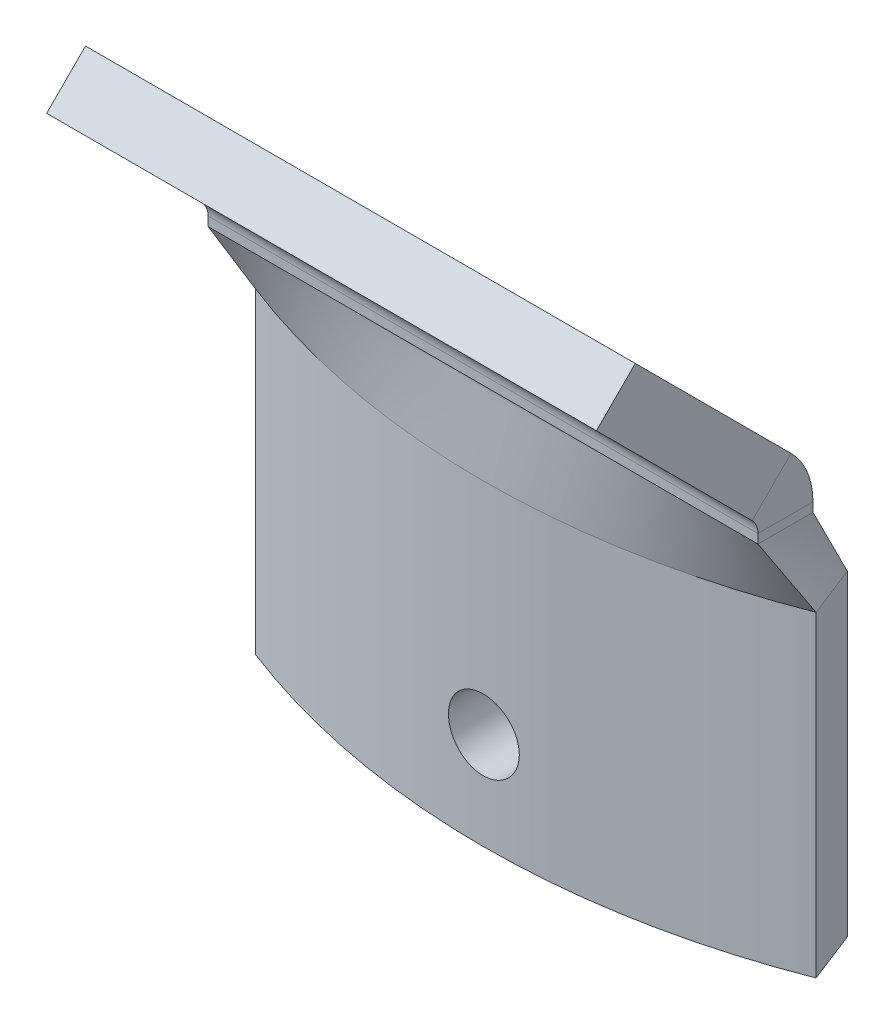
ISO-10303-21;
HEADER;
FILE_DESCRIPTION(('STEP AP214'),'2;1');
FILE_NAME('part.step','',(''),(''),'','','');
FILE_SCHEMA(('AUTOMOTIVE_DESIGN { 1 0 10303 214 1 1 1 1 }'));
ENDSEC;
DATA;
#1=APPLICATION_CONTEXT('core data for automotive mechanical design processes');
#2=APPLICATION_PROTOCOL_DEFINITION('international standard','automotive_design',2000,#1);
#3=PRODUCT_CONTEXT('',#1,'mechanical');
#4=PRODUCT('Part','Part','',(#3));
#5=PRODUCT_RELATED_PRODUCT_CATEGORY('part','',(#4));
#6=PRODUCT_DEFINITION_FORMATION('','',#4);
#7=PRODUCT_DEFINITION_CONTEXT('part definition',#1,'design');
#8=PRODUCT_DEFINITION('design','',#6,#7);
#9=PRODUCT_DEFINITION_SHAPE('','',#8);
#10=(LENGTH_UNIT() NAMED_UNIT(*) SI_UNIT(.MILLI.,.METRE.));
#11=(NAMED_UNIT(*) PLANE_ANGLE_UNIT() SI_UNIT($,.RADIAN.));
#12=(NAMED_UNIT(*) SI_UNIT($,.STERADIAN.) SOLID_ANGLE_UNIT());
#13=UNCERTAINTY_MEASURE_WITH_UNIT(LENGTH_MEASURE(1.E-05),#10,'distance_accuracy_value','');
#14=(GEOMETRIC_REPRESENTATION_CONTEXT(3) GLOBAL_UNCERTAINTY_ASSIGNED_CONTEXT((#13)) GLOBAL_UNIT_ASSIGNED_CONTEXT((#10,
#11,#12)) REPRESENTATION_CONTEXT('',''));
#15=CARTESIAN_POINT('',(0.,0.,0.));
#16=DIRECTION('',(0.,0.,1.));
#17=DIRECTION('',(1.,0.,0.));
#18=AXIS2_PLACEMENT_3D('',#15,#16,#17);
#19=CARTESIAN_POINT('',(15.875,27.8049191854904,12.5038015345885));
#20=DIRECTION('',(-1.,0.,0.));
#21=DIRECTION('',(0.,-0.707106781186546,-0.707106781186549));
#22=AXIS2_PLACEMENT_3D('',#19,#20,#21);
#23=PLANE('',#22);
#24=DIRECTION('',(0.,0.707106781186546,0.707106781186549));
#25=VECTOR('',#24,1.);
#26=CARTESIAN_POINT('',(15.875,27.8049191854904,12.5038015345885));
#27=LINE('',#26,#25);
#28=CARTESIAN_POINT('',(15.875,18.8108946000057,3.50977694910378));
#29=VERTEX_POINT('',#28);
#30=CARTESIAN_POINT('',(15.875,27.8049191854904,12.5038015345885));
#31=VERTEX_POINT('',#30);
#32=EDGE_CURVE('E126',#29,#31,#27,.T.);
#33=ORIENTED_EDGE('',*,*,#32,.F.);
#34=DIRECTION('',(0.,0.707106781186554,-0.707106781186541));
#35=VECTOR('',#34,1.);
#36=CARTESIAN_POINT('',(15.875,18.8108946000058,3.5097769491037));
#37=LINE('',#36,#35);
#38=CARTESIAN_POINT('',(15.875,21.055958630273,1.26471291883649));
#39=VERTEX_POINT('',#38);
#40=EDGE_CURVE('E379',#29,#39,#37,.T.);
#41=ORIENTED_EDGE('',*,*,#40,.T.);
#42=DIRECTION('',(0.,0.707106781186546,0.707106781186549));
#43=VECTOR('',#42,1.);
#44=CARTESIAN_POINT('',(15.875,30.0499832157577,10.2587375043212));
#45=LINE('',#44,#43);
#46=CARTESIAN_POINT('',(15.875,30.0499832157577,10.2587375043212));
#47=VERTEX_POINT('',#46);
#48=EDGE_CURVE('E82',#39,#47,#45,.T.);
#49=ORIENTED_EDGE('',*,*,#48,.T.);
#50=DIRECTION('',(0.,0.707106781186549,-0.707106781186546));
#51=VECTOR('',#50,1.);
#52=CARTESIAN_POINT('',(15.875,27.8049191854904,12.5038015345885));
#53=LINE('',#52,#51);
#54=EDGE_CURVE('E461',#31,#47,#53,.T.);
#55=ORIENTED_EDGE('',*,*,#54,.F.);
#56=EDGE_LOOP('',(#33,#41,#49,#55));
#57=FACE_BOUND('',#56,.T.);
#58=ADVANCED_FACE('F61',(#57),#23,.F.);
#59=CARTESIAN_POINT('',(-15.875,27.8049191854904,12.5038015345885));
#60=DIRECTION('',(1.,0.,0.));
#61=DIRECTION('',(0.,0.707106781186546,0.707106781186549));
#62=AXIS2_PLACEMENT_3D('',#59,#60,#61);
#63=PLANE('',#62);
#64=DIRECTION('',(0.,-0.707106781186546,-0.707106781186549));
#65=VECTOR('',#64,1.);
#66=CARTESIAN_POINT('',(-15.875,30.0499832157577,10.2587375043212));
#67=LINE('',#66,#65);
#68=CARTESIAN_POINT('',(-15.875,30.0499832157577,10.2587375043212));
#69=VERTEX_POINT('',#68);
#70=CARTESIAN_POINT('',(-15.875,21.055958630273,1.26471291883649));
#71=VERTEX_POINT('',#70);
#72=EDGE_CURVE('E415',#69,#71,#67,.T.);
#73=ORIENTED_EDGE('',*,*,#72,.T.);
#74=DIRECTION('',(0.,-0.707106781186554,0.707106781186541));
#75=VECTOR('',#74,1.);
#76=CARTESIAN_POINT('',(-15.875,18.8108946000058,3.5097769491037));
#77=LINE('',#76,#75);
#78=CARTESIAN_POINT('',(-15.875,18.8108946000057,3.50977694910378));
#79=VERTEX_POINT('',#78);
#80=EDGE_CURVE('E464',#71,#79,#77,.T.);
#81=ORIENTED_EDGE('',*,*,#80,.T.);
#82=DIRECTION('',(0.,-0.707106781186546,-0.707106781186549));
#83=VECTOR('',#82,1.);
#84=CARTESIAN_POINT('',(-15.875,27.8049191854904,12.5038015345885));
#85=LINE('',#84,#83);
#86=CARTESIAN_POINT('',(-15.875,27.8049191854904,12.5038015345885));
#87=VERTEX_POINT('',#86);
#88=EDGE_CURVE('E458',#87,#79,#85,.T.);
#89=ORIENTED_EDGE('',*,*,#88,.F.);
#90=DIRECTION('',(0.,0.707106781186549,-0.707106781186546));
#91=VECTOR('',#90,1.);
#92=CARTESIAN_POINT('',(-15.875,27.8049191854904,12.5038015345885));
#93=LINE('',#92,#91);
#94=EDGE_CURVE('E455',#87,#69,#93,.T.);
#95=ORIENTED_EDGE('',*,*,#94,.T.);
#96=EDGE_LOOP('',(#73,#81,#89,#95));
#97=FACE_BOUND('',#96,.T.);
#98=ADVANCED_FACE('F349',(#97),#63,.F.);
#99=CARTESIAN_POINT('',(0.,6.84500139891504,-12.9462443125215));
#100=DIRECTION('',(0.,-0.707106781186549,0.707106781186546));
#101=DIRECTION('',(1.,0.,0.));
#102=AXIS2_PLACEMENT_3D('',#99,#100,#101);
#103=PLANE('',#102);
#104=CARTESIAN_POINT('',(9.525,27.2481433059841,7.45689759454761));
#105=DIRECTION('',(0.,-0.707106781186549,0.707106781186546));
#106=DIRECTION('',(0.,-0.707106781186546,-0.707106781186549));
#107=AXIS2_PLACEMENT_3D('',#104,#105,#106);
#108=CIRCLE('',#107,2.51460000000001);
#109=CARTESIAN_POINT('',(9.525,25.4700525940124,5.6788068825759));
#110=VERTEX_POINT('',#109);
#111=EDGE_CURVE('E378',#110,#110,#108,.T.);
#112=ORIENTED_EDGE('',*,*,#111,.T.);
#113=EDGE_LOOP('',(#112));
#114=FACE_BOUND('',#113,.T.);
#115=CARTESIAN_POINT('',(-9.525,27.2481433059841,7.45689759454761));
#116=DIRECTION('',(0.,-0.707106781186549,0.707106781186546));
#117=DIRECTION('',(0.,-0.707106781186546,-0.707106781186549));
#118=AXIS2_PLACEMENT_3D('',#115,#116,#117);
#119=CIRCLE('',#118,2.5146);
#120=CARTESIAN_POINT('',(-9.525,25.4700525940124,5.67880688257591));
#121=VERTEX_POINT('',#120);
#122=EDGE_CURVE('E376',#121,#121,#119,.T.);
#123=ORIENTED_EDGE('',*,*,#122,.T.);
#124=EDGE_LOOP('',(#123));
#125=FACE_BOUND('',#124,.T.);
#126=ORIENTED_EDGE('',*,*,#48,.F.);
#127=DIRECTION('',(-1.,0.,0.));
#128=VECTOR('',#127,1.);
#129=CARTESIAN_POINT('',(0.,21.055958630273,1.2647129188365));
#130=LINE('',#129,#128);
#131=EDGE_CURVE('E384',#39,#71,#130,.T.);
#132=ORIENTED_EDGE('',*,*,#131,.T.);
#133=ORIENTED_EDGE('',*,*,#72,.F.);
#134=DIRECTION('',(-1.,0.,0.));
#135=VECTOR('',#134,1.);
#136=CARTESIAN_POINT('',(-15.875,30.0499832157577,10.2587375043212));
#137=LINE('',#136,#135);
#138=EDGE_CURVE('E456',#47,#69,#137,.T.);
#139=ORIENTED_EDGE('',*,*,#138,.F.);
#140=EDGE_LOOP('',(#126,#132,#133,#139));
#141=FACE_BOUND('',#140,.T.);
#142=ADVANCED_FACE('F347',(#114,#125,#141),#103,.F.);
#143=CARTESIAN_POINT('',(0.,4.59993736864775,-10.7011802822543));
#144=DIRECTION('',(0.,-0.707106781186549,0.707106781186546));
#145=DIRECTION('',(1.,0.,0.));
#146=AXIS2_PLACEMENT_3D('',#143,#144,#145);
#147=PLANE('',#146);
#148=CARTESIAN_POINT('',(9.525,25.0030792757168,9.70196162481489));
#149=DIRECTION('',(0.,-0.707106781186549,0.707106781186546));
#150=DIRECTION('',(0.,-0.707106781186546,-0.707106781186549));
#151=AXIS2_PLACEMENT_3D('',#148,#149,#150);
#152=CIRCLE('',#151,2.51460000000001);
#153=CARTESIAN_POINT('',(9.525,23.2249885637451,7.92387091284319));
#154=VERTEX_POINT('',#153);
#155=EDGE_CURVE('E397',#154,#154,#152,.F.);
#156=ORIENTED_EDGE('',*,*,#155,.T.);
#157=EDGE_LOOP('',(#156));
#158=FACE_BOUND('',#157,.T.);
#159=CARTESIAN_POINT('',(-9.525,25.0030792757168,9.70196162481489));
#160=DIRECTION('',(0.,-0.707106781186549,0.707106781186546));
#161=DIRECTION('',(0.,-0.707106781186546,-0.707106781186549));
#162=AXIS2_PLACEMENT_3D('',#159,#160,#161);
#163=CIRCLE('',#162,2.5146);
#164=CARTESIAN_POINT('',(-9.525,23.2249885637451,7.9238709128432));
#165=VERTEX_POINT('',#164);
#166=EDGE_CURVE('E394',#165,#165,#163,.F.);
#167=ORIENTED_EDGE('',*,*,#166,.T.);
#168=EDGE_LOOP('',(#167));
#169=FACE_BOUND('',#168,.T.);
#170=DIRECTION('',(-1.,0.,0.));
#171=VECTOR('',#170,1.);
#172=CARTESIAN_POINT('',(0.,18.8108946000057,3.50977694910377));
#173=LINE('',#172,#171);
#174=EDGE_CURVE('E120',#29,#79,#173,.T.);
#175=ORIENTED_EDGE('',*,*,#174,.F.);
#176=ORIENTED_EDGE('',*,*,#32,.T.);
#177=DIRECTION('',(-1.,0.,0.));
#178=VECTOR('',#177,1.);
#179=CARTESIAN_POINT('',(-15.875,27.8049191854904,12.5038015345885));
#180=LINE('',#179,#178);
#181=EDGE_CURVE('E124',#31,#87,#180,.T.);
#182=ORIENTED_EDGE('',*,*,#181,.T.);
#183=ORIENTED_EDGE('',*,*,#88,.T.);
#184=EDGE_LOOP('',(#175,#176,#182,#183));
#185=FACE_BOUND('',#184,.T.);
#186=ADVANCED_FACE('F343',(#158,#169,#185),#147,.T.);
#187=CARTESIAN_POINT('',(-15.875,27.8049191854904,12.5038015345885));
#188=DIRECTION('',(0.,-0.707106781186546,-0.707106781186549));
#189=DIRECTION('',(0.,0.707106781186549,-0.707106781186546));
#190=AXIS2_PLACEMENT_3D('',#187,#188,#189);
#191=PLANE('',#190);
#192=ORIENTED_EDGE('',*,*,#138,.T.);
#193=ORIENTED_EDGE('',*,*,#94,.F.);
#194=ORIENTED_EDGE('',*,*,#181,.F.);
#195=ORIENTED_EDGE('',*,*,#54,.T.);
#196=EDGE_LOOP('',(#192,#193,#194,#195));
#197=FACE_BOUND('',#196,.T.);
#198=ADVANCED_FACE('F339',(#197),#191,.F.);
#199=CARTESIAN_POINT('',(9.525,25.0030792757168,9.70196162481489));
#200=DIRECTION('',(0.,0.707106781186549,-0.707106781186546));
#201=DIRECTION('',(-1.,0.,0.));
#202=AXIS2_PLACEMENT_3D('',#199,#200,#201);
#203=CYLINDRICAL_SURFACE('',#202,2.1336);
#204=CARTESIAN_POINT('',(9.525,26.978735622352,7.72630527817969));
#205=DIRECTION('',(0.,-0.707106781186553,0.707106781186542));
#206=DIRECTION('',(0.,-0.707106781186542,-0.707106781186553));
#207=AXIS2_PLACEMENT_3D('',#204,#205,#206);
#208=CIRCLE('',#207,2.1336);
#209=CARTESIAN_POINT('',(9.525,25.4700525940124,6.21762224984006));
#210=VERTEX_POINT('',#209);
#211=EDGE_CURVE('E391',#210,#210,#208,.F.);
#212=ORIENTED_EDGE('',*,*,#211,.T.);
#213=EDGE_LOOP('',(#212));
#214=FACE_BOUND('',#213,.T.);
#215=CARTESIAN_POINT('',(9.525,25.2724869593489,9.43255394118281));
#216=DIRECTION('',(0.,-0.707106781186552,0.707106781186543));
#217=DIRECTION('',(0.,-0.707106781186543,-0.707106781186552));
#218=AXIS2_PLACEMENT_3D('',#215,#216,#217);
#219=CIRCLE('',#218,2.1336);
#220=CARTESIAN_POINT('',(9.525,23.7638039310093,7.92387091284319));
#221=VERTEX_POINT('',#220);
#222=EDGE_CURVE('E382',#221,#221,#219,.T.);
#223=ORIENTED_EDGE('',*,*,#222,.T.);
#224=EDGE_LOOP('',(#223));
#225=FACE_BOUND('',#224,.T.);
#226=ADVANCED_FACE('F335',(#214,#225),#203,.F.);
#227=CARTESIAN_POINT('',(-9.525,25.0030792757168,9.70196162481489));
#228=DIRECTION('',(0.,0.707106781186549,-0.707106781186546));
#229=DIRECTION('',(-1.,0.,0.));
#230=AXIS2_PLACEMENT_3D('',#227,#228,#229);
#231=CYLINDRICAL_SURFACE('',#230,2.1336);
#232=CARTESIAN_POINT('',(-9.525,26.978735622352,7.72630527817969));
#233=DIRECTION('',(0.,-0.707106781186553,0.707106781186542));
#234=DIRECTION('',(0.,-0.707106781186542,-0.707106781186553));
#235=AXIS2_PLACEMENT_3D('',#232,#233,#234);
#236=CIRCLE('',#235,2.1336);
#237=CARTESIAN_POINT('',(-9.525,25.4700525940124,6.21762224984006));
#238=VERTEX_POINT('',#237);
#239=EDGE_CURVE('E74',#238,#238,#236,.F.);
#240=ORIENTED_EDGE('',*,*,#239,.T.);
#241=EDGE_LOOP('',(#240));
#242=FACE_BOUND('',#241,.T.);
#243=CARTESIAN_POINT('',(-9.525,25.2724869593489,9.43255394118282));
#244=DIRECTION('',(0.,-0.707106781186552,0.707106781186543));
#245=DIRECTION('',(0.,-0.707106781186543,-0.707106781186552));
#246=AXIS2_PLACEMENT_3D('',#243,#244,#245);
#247=CIRCLE('',#246,2.1336);
#248=CARTESIAN_POINT('',(-9.525,23.7638039310093,7.92387091284319));
#249=VERTEX_POINT('',#248);
#250=EDGE_CURVE('E400',#249,#249,#247,.T.);
#251=ORIENTED_EDGE('',*,*,#250,.T.);
#252=EDGE_LOOP('',(#251));
#253=FACE_BOUND('',#252,.T.);
#254=ADVANCED_FACE('F322',(#242,#253),#231,.F.);
#255=CARTESIAN_POINT('',(0.,0.,3.175));
#256=DIRECTION('',(0.,0.,1.));
#257=DIRECTION('',(1.,0.,0.));
#258=AXIS2_PLACEMENT_3D('',#255,#256,#257);
#259=PLANE('',#258);
#260=DIRECTION('',(0.,1.,0.));
#261=VECTOR('',#260,1.);
#262=CARTESIAN_POINT('',(15.875,32.8168,3.175));
#263=LINE('',#262,#261);
#264=CARTESIAN_POINT('',(15.875,17.4752,3.175));
#265=VERTEX_POINT('',#264);
#266=CARTESIAN_POINT('',(15.875,18.0026715491095,3.175));
#267=VERTEX_POINT('',#266);
#268=EDGE_CURVE('E411',#265,#267,#263,.T.);
#269=ORIENTED_EDGE('',*,*,#268,.T.);
#270=DIRECTION('',(-1.,0.,0.));
#271=VECTOR('',#270,1.);
#272=CARTESIAN_POINT('',(0.,18.0026715491095,3.175));
#273=LINE('',#272,#271);
#274=CARTESIAN_POINT('',(-15.875,18.0026715491095,3.175));
#275=VERTEX_POINT('',#274);
#276=EDGE_CURVE('E410',#267,#275,#273,.T.);
#277=ORIENTED_EDGE('',*,*,#276,.T.);
#278=DIRECTION('',(0.,-1.,0.));
#279=VECTOR('',#278,1.);
#280=CARTESIAN_POINT('',(-15.875,32.8168,3.175));
#281=LINE('',#280,#279);
#282=CARTESIAN_POINT('',(-15.875,17.4752,3.175));
#283=VERTEX_POINT('',#282);
#284=EDGE_CURVE('E408',#275,#283,#281,.T.);
#285=ORIENTED_EDGE('',*,*,#284,.T.);
#286=DIRECTION('',(1.,0.,0.));
#287=VECTOR('',#286,1.);
#288=CARTESIAN_POINT('',(0.,17.4752,3.175));
#289=LINE('',#288,#287);
#290=EDGE_CURVE('E102',#283,#265,#289,.T.);
#291=ORIENTED_EDGE('',*,*,#290,.T.);
#292=EDGE_LOOP('',(#269,#277,#285,#291));
#293=FACE_BOUND('',#292,.T.);
#294=ADVANCED_FACE('F318',(#293),#259,.T.);
#295=CARTESIAN_POINT('',(-15.875,32.8168,3.175));
#296=DIRECTION('',(1.,0.,0.));
#297=DIRECTION('',(0.,1.,0.));
#298=AXIS2_PLACEMENT_3D('',#295,#296,#297);
#299=PLANE('',#298);
#300=DIRECTION('',(0.,0.,1.));
#301=VECTOR('',#300,1.);
#302=CARTESIAN_POINT('',(-15.875,18.0026715491095,3.1749999999999));
#303=LINE('',#302,#301);
#304=CARTESIAN_POINT('',(-15.875,18.0026715491095,0.));
#305=VERTEX_POINT('',#304);
#306=EDGE_CURVE('E418',#305,#275,#303,.T.);
#307=ORIENTED_EDGE('',*,*,#306,.F.);
#308=DIRECTION('',(0.,-1.,0.));
#309=VECTOR('',#308,1.);
#310=CARTESIAN_POINT('',(-15.875,32.8168,0.));
#311=LINE('',#310,#309);
#312=CARTESIAN_POINT('',(-15.875,17.4752,0.));
#313=VERTEX_POINT('',#312);
#314=EDGE_CURVE('E404',#305,#313,#311,.T.);
#315=ORIENTED_EDGE('',*,*,#314,.T.);
#316=DIRECTION('',(0.,0.,1.));
#317=VECTOR('',#316,1.);
#318=CARTESIAN_POINT('',(-15.875,17.4752,3.175));
#319=LINE('',#318,#317);
#320=EDGE_CURVE('E212',#283,#313,#319,.F.);
#321=ORIENTED_EDGE('',*,*,#320,.F.);
#322=ORIENTED_EDGE('',*,*,#284,.F.);
#323=EDGE_LOOP('',(#307,#315,#321,#322));
#324=FACE_BOUND('',#323,.T.);
#325=ADVANCED_FACE('F321',(#324),#299,.F.);
#326=CARTESIAN_POINT('',(0.,0.,0.));
#327=DIRECTION('',(0.,0.,1.));
#328=DIRECTION('',(1.,0.,0.));
#329=AXIS2_PLACEMENT_3D('',#326,#327,#328);
#330=PLANE('',#329);
#331=DIRECTION('',(-1.,0.,0.));
#332=VECTOR('',#331,1.);
#333=CARTESIAN_POINT('',(0.,18.0026715491095,0.));
#334=LINE('',#333,#332);
#335=CARTESIAN_POINT('',(15.875,18.0026715491095,0.));
#336=VERTEX_POINT('',#335);
#337=EDGE_CURVE('E427',#336,#305,#334,.T.);
#338=ORIENTED_EDGE('',*,*,#337,.F.);
#339=DIRECTION('',(0.,1.,0.));
#340=VECTOR('',#339,1.);
#341=CARTESIAN_POINT('',(15.875,32.8168,0.));
#342=LINE('',#341,#340);
#343=CARTESIAN_POINT('',(15.875,17.4752,0.));
#344=VERTEX_POINT('',#343);
#345=EDGE_CURVE('E413',#344,#336,#342,.T.);
#346=ORIENTED_EDGE('',*,*,#345,.F.);
#347=DIRECTION('',(1.,0.,0.));
#348=VECTOR('',#347,1.);
#349=CARTESIAN_POINT('',(0.,17.4752,0.));
#350=LINE('',#349,#348);
#351=EDGE_CURVE('E416',#313,#344,#350,.T.);
#352=ORIENTED_EDGE('',*,*,#351,.F.);
#353=ORIENTED_EDGE('',*,*,#314,.F.);
#354=EDGE_LOOP('',(#338,#346,#352,#353));
#355=FACE_BOUND('',#354,.T.);
#356=ADVANCED_FACE('F325',(#355),#330,.F.);
#357=CARTESIAN_POINT('',(15.875,32.8168,3.175));
#358=DIRECTION('',(-1.,0.,0.));
#359=DIRECTION('',(0.,-1.,0.));
#360=AXIS2_PLACEMENT_3D('',#357,#358,#359);
#361=PLANE('',#360);
#362=DIRECTION('',(0.,0.,-1.));
#363=VECTOR('',#362,1.);
#364=CARTESIAN_POINT('',(15.875,18.0026715491095,3.1749999999999));
#365=LINE('',#364,#363);
#366=EDGE_CURVE('E433',#267,#336,#365,.T.);
#367=ORIENTED_EDGE('',*,*,#366,.F.);
#368=ORIENTED_EDGE('',*,*,#268,.F.);
#369=DIRECTION('',(0.,0.,1.));
#370=VECTOR('',#369,1.);
#371=CARTESIAN_POINT('',(15.875,17.4752,3.175));
#372=LINE('',#371,#370);
#373=EDGE_CURVE('E407',#265,#344,#372,.F.);
#374=ORIENTED_EDGE('',*,*,#373,.T.);
#375=ORIENTED_EDGE('',*,*,#345,.T.);
#376=EDGE_LOOP('',(#367,#368,#374,#375));
#377=FACE_BOUND('',#376,.T.);
#378=ADVANCED_FACE('F313',(#377),#361,.F.);
#379=CARTESIAN_POINT('',(15.875,18.0026715491095,4.318));
#380=DIRECTION('',(-1.,0.,0.));
#381=DIRECTION('',(0.,0.,1.));
#382=AXIS2_PLACEMENT_3D('',#379,#380,#381);
#383=PLANE('',#382);
#384=ORIENTED_EDGE('',*,*,#366,.T.);
#385=CARTESIAN_POINT('',(15.875,18.0026715491095,4.318));
#386=DIRECTION('',(-1.,0.,0.));
#387=DIRECTION('',(0.,0.,1.));
#388=AXIS2_PLACEMENT_3D('',#385,#386,#387);
#389=CIRCLE('',#388,4.318);
#390=EDGE_CURVE('E229',#336,#39,#389,.F.);
#391=ORIENTED_EDGE('',*,*,#390,.T.);
#392=ORIENTED_EDGE('',*,*,#40,.F.);
#393=CARTESIAN_POINT('',(15.875,18.0026715491095,4.318));
#394=DIRECTION('',(1.,0.,0.));
#395=DIRECTION('',(0.,0.,-1.));
#396=AXIS2_PLACEMENT_3D('',#393,#394,#395);
#397=CIRCLE('',#396,1.143);
#398=EDGE_CURVE('E439',#267,#29,#397,.T.);
#399=ORIENTED_EDGE('',*,*,#398,.F.);
#400=EDGE_LOOP('',(#384,#391,#392,#399));
#401=FACE_BOUND('',#400,.T.);
#402=ADVANCED_FACE('F310',(#401),#383,.F.);
#403=CARTESIAN_POINT('',(-15.875,18.0026715491095,4.318));
#404=DIRECTION('',(1.,0.,0.));
#405=DIRECTION('',(0.,0.,-1.));
#406=AXIS2_PLACEMENT_3D('',#403,#404,#405);
#407=PLANE('',#406);
#408=CARTESIAN_POINT('',(-15.875,18.0026715491095,4.318));
#409=DIRECTION('',(-1.,0.,0.));
#410=DIRECTION('',(0.,0.,1.));
#411=AXIS2_PLACEMENT_3D('',#408,#409,#410);
#412=CIRCLE('',#411,4.318);
#413=EDGE_CURVE('E444',#71,#305,#412,.T.);
#414=ORIENTED_EDGE('',*,*,#413,.T.);
#415=ORIENTED_EDGE('',*,*,#306,.T.);
#416=CARTESIAN_POINT('',(-15.875,18.0026715491095,4.318));
#417=DIRECTION('',(-1.,0.,0.));
#418=DIRECTION('',(0.,0.,1.));
#419=AXIS2_PLACEMENT_3D('',#416,#417,#418);
#420=CIRCLE('',#419,1.143);
#421=EDGE_CURVE('E441',#79,#275,#420,.T.);
#422=ORIENTED_EDGE('',*,*,#421,.F.);
#423=ORIENTED_EDGE('',*,*,#80,.F.);
#424=EDGE_LOOP('',(#414,#415,#422,#423));
#425=FACE_BOUND('',#424,.T.);
#426=ADVANCED_FACE('F304',(#425),#407,.F.);
#427=CARTESIAN_POINT('',(31.9770341422743,18.0026715491095,4.318));
#428=DIRECTION('',(-1.,0.,0.));
#429=DIRECTION('',(0.,0.,1.));
#430=AXIS2_PLACEMENT_3D('',#427,#428,#429);
#431=CYLINDRICAL_SURFACE('',#430,1.143);
#432=ORIENTED_EDGE('',*,*,#174,.T.);
#433=ORIENTED_EDGE('',*,*,#421,.T.);
#434=ORIENTED_EDGE('',*,*,#276,.F.);
#435=ORIENTED_EDGE('',*,*,#398,.T.);
#436=EDGE_LOOP('',(#432,#433,#434,#435));
#437=FACE_BOUND('',#436,.T.);
#438=ADVANCED_FACE('F295',(#437),#431,.F.);
#439=CARTESIAN_POINT('',(31.9770341422743,18.0026715491095,4.318));
#440=DIRECTION('',(-1.,0.,0.));
#441=DIRECTION('',(0.,0.,1.));
#442=AXIS2_PLACEMENT_3D('',#439,#440,#441);
#443=CYLINDRICAL_SURFACE('',#442,4.318);
#444=ORIENTED_EDGE('',*,*,#131,.F.);
#445=ORIENTED_EDGE('',*,*,#390,.F.);
#446=ORIENTED_EDGE('',*,*,#337,.T.);
#447=ORIENTED_EDGE('',*,*,#413,.F.);
#448=EDGE_LOOP('',(#444,#445,#446,#447));
#449=FACE_BOUND('',#448,.T.);
#450=ADVANCED_FACE('F303',(#449),#443,.T.);
#451=CARTESIAN_POINT('',(9.525,27.2481433059841,7.45689759454761));
#452=DIRECTION('',(0.,0.707106781186553,-0.707106781186542));
#453=DIRECTION('',(0.,0.707106781186542,0.707106781186553));
#454=AXIS2_PLACEMENT_3D('',#451,#452,#453);
#455=CONICAL_SURFACE('',#454,2.51460000000001,0.785398163397443);
#456=ORIENTED_EDGE('',*,*,#211,.F.);
#457=EDGE_LOOP('',(#456));
#458=FACE_BOUND('',#457,.T.);
#459=ORIENTED_EDGE('',*,*,#111,.F.);
#460=EDGE_LOOP('',(#459));
#461=FACE_BOUND('',#460,.T.);
#462=ADVANCED_FACE('F308',(#458,#461),#455,.F.);
#463=CARTESIAN_POINT('',(9.525,25.2724869593489,9.43255394118281));
#464=DIRECTION('',(0.,-0.707106781186552,0.707106781186543));
#465=DIRECTION('',(0.,-0.707106781186543,-0.707106781186552));
#466=AXIS2_PLACEMENT_3D('',#463,#464,#465);
#467=CONICAL_SURFACE('',#466,2.1336,0.785398163397445);
#468=ORIENTED_EDGE('',*,*,#155,.F.);
#469=EDGE_LOOP('',(#468));
#470=FACE_BOUND('',#469,.T.);
#471=ORIENTED_EDGE('',*,*,#222,.F.);
#472=EDGE_LOOP('',(#471));
#473=FACE_BOUND('',#472,.T.);
#474=ADVANCED_FACE('F360',(#470,#473),#467,.F.);
#475=CARTESIAN_POINT('',(-9.525,27.2481433059841,7.45689759454761));
#476=DIRECTION('',(0.,0.707106781186553,-0.707106781186542));
#477=DIRECTION('',(0.,0.707106781186542,0.707106781186553));
#478=AXIS2_PLACEMENT_3D('',#475,#476,#477);
#479=CONICAL_SURFACE('',#478,2.5146,0.785398163397447);
#480=ORIENTED_EDGE('',*,*,#239,.F.);
#481=EDGE_LOOP('',(#480));
#482=FACE_BOUND('',#481,.T.);
#483=ORIENTED_EDGE('',*,*,#122,.F.);
#484=EDGE_LOOP('',(#483));
#485=FACE_BOUND('',#484,.T.);
#486=ADVANCED_FACE('F363',(#482,#485),#479,.F.);
#487=CARTESIAN_POINT('',(-9.525,25.2724869593489,9.43255394118282));
#488=DIRECTION('',(0.,-0.707106781186552,0.707106781186543));
#489=DIRECTION('',(0.,-0.707106781186543,-0.707106781186552));
#490=AXIS2_PLACEMENT_3D('',#487,#488,#489);
#491=CONICAL_SURFACE('',#490,2.1336,0.785398163397448);
#492=ORIENTED_EDGE('',*,*,#166,.F.);
#493=EDGE_LOOP('',(#492));
#494=FACE_BOUND('',#493,.T.);
#495=ORIENTED_EDGE('',*,*,#250,.F.);
#496=EDGE_LOOP('',(#495));
#497=FACE_BOUND('',#496,.T.);
#498=ADVANCED_FACE('F63',(#494,#497),#491,.F.);
#499=CARTESIAN_POINT('',(15.875,17.4752,0.));
#500=CARTESIAN_POINT('',(15.0418106878909,12.7,-2.82165661307006));
#501=CARTESIAN_POINT('',(15.875,17.4752,0.529166666666666));
#502=CARTESIAN_POINT('',(15.233592239909,12.7,-2.32846578041336));
#503=CARTESIAN_POINT('',(15.875,17.4752,1.05833333333333));
#504=CARTESIAN_POINT('',(15.4253737919272,12.7,-1.83527494775667));
#505=CARTESIAN_POINT('',(15.875,17.4752,2.11666666666667));
#506=CARTESIAN_POINT('',(15.8089368959636,12.7,-0.848893282443278));
#507=CARTESIAN_POINT('',(15.875,17.4752,2.64583333333333));
#508=CARTESIAN_POINT('',(16.0007184479818,12.7,-0.355702449786584));
#509=CARTESIAN_POINT('',(15.875,17.4752,3.175));
#510=CARTESIAN_POINT('',(16.1925,12.7,0.137488382870109));
#511=B_SPLINE_SURFACE_WITH_KNOTS('',3,1,((#499,#500),(#501,#502),(#503,#504),(#505,#506),(#507,
#508),(#509,#510)),.UNSPECIFIED.,.F.,.F.,.F.,(4,2,4),(2,2),(0.,0.5,1.),(0.,1.),.UNSPECIFIED.);
#512=DIRECTION('',(0.0560130983360832,-0.842436998974724,-0.53587539183401));
#513=VECTOR('',#512,1.);
#514=CARTESIAN_POINT('',(16.03375,15.0876,1.65624419143505));
#515=LINE('',#514,#513);
#516=CARTESIAN_POINT('',(16.1925,12.7,0.137488382870102));
#517=VERTEX_POINT('',#516);
#518=EDGE_CURVE('E224',#265,#517,#515,.T.);
#519=DIRECTION('',(-0.362421830585554,0.,-0.932014171949663));
#520=VECTOR('',#519,1.);
#521=CARTESIAN_POINT('',(16.1925,12.7,0.137488382870109));
#522=LINE('',#521,#520);
#523=CARTESIAN_POINT('',(15.0418106878908,12.7,-2.82165661307005));
#524=VERTEX_POINT('',#523);
#525=EDGE_CURVE('E214',#517,#524,#522,.T.);
#526=DIRECTION('',(0.148550728148978,0.851378464350822,0.503077918026665));
#527=VECTOR('',#526,1.);
#528=CARTESIAN_POINT('',(15.4584053439454,15.0876,-1.41082830653503));
#529=LINE('',#528,#527);
#530=EDGE_CURVE('E204',#524,#344,#529,.T.);
#531=ORIENTED_EDGE('',*,*,#373,.F.);
#532=ORIENTED_EDGE('',*,*,#518,.T.);
#533=ORIENTED_EDGE('',*,*,#525,.T.);
#534=ORIENTED_EDGE('',*,*,#530,.T.);
#535=EDGE_LOOP('',(#531,#532,#533,#534));
#536=FACE_BOUND('',#535,.T.);
#537=ADVANCED_FACE('F241',(#536),#511,.T.);
#538=CARTESIAN_POINT('',(15.875,17.4752,3.175));
#539=CARTESIAN_POINT('',(16.1925,12.7,0.137488382870116));
#540=CARTESIAN_POINT('',(13.2291666666667,17.4752,3.175));
#541=CARTESIAN_POINT('',(13.6772267534508,12.7,1.11557429816289));
#542=CARTESIAN_POINT('',(10.5833333333333,17.4752,3.175));
#543=CARTESIAN_POINT('',(11.0291146055317,12.7,1.88078946754483));
#544=CARTESIAN_POINT('',(5.29166666666667,17.4752,3.175));
#545=CARTESIAN_POINT('',(5.58700822045996,12.7,2.9107215370682));
#546=CARTESIAN_POINT('',(2.64583333333334,17.4752,3.175));
#547=CARTESIAN_POINT('',(2.79371656707528,12.7,3.175));
#548=CARTESIAN_POINT('',(-2.64583333333333,17.4752,3.175));
#549=CARTESIAN_POINT('',(-2.79371656707528,12.7,3.175));
#550=CARTESIAN_POINT('',(-5.29166666666667,17.4752,3.175));
#551=CARTESIAN_POINT('',(-5.58700822045998,12.7,2.9107215370682));
#552=CARTESIAN_POINT('',(-10.5833333333333,17.4752,3.175));
#553=CARTESIAN_POINT('',(-11.0291146055317,12.7,1.88078946754483));
#554=CARTESIAN_POINT('',(-13.2291666666667,17.4752,3.175));
#555=CARTESIAN_POINT('',(-13.6772267534508,12.7,1.11557429816289));
#556=CARTESIAN_POINT('',(-15.875,17.4752,3.175));
#557=CARTESIAN_POINT('',(-16.1925,12.7,0.137488382870109));
#558=B_SPLINE_SURFACE_WITH_KNOTS('',3,1,((#538,#539),(#540,#541),(#542,#543),(#544,#545),(#546,
#547),(#548,#549),(#550,#551),(#552,#553),(#554,#555),(#556,#557)),.UNSPECIFIED.,.F.,.F.,.F.,(4,
2,2,2,4),(2,2),(0.,0.25,0.5,0.75,1.),(0.,1.),.UNSPECIFIED.);
#559=DIRECTION('',(-0.0560130983360826,-0.842436998974724,-0.53587539183401));
#560=VECTOR('',#559,1.);
#561=CARTESIAN_POINT('',(-16.03375,15.0876,1.65624419143505));
#562=LINE('',#561,#560);
#563=CARTESIAN_POINT('',(-16.1925,12.7,0.137488382870109));
#564=VERTEX_POINT('',#563);
#565=EDGE_CURVE('E213',#283,#564,#562,.T.);
#566=CARTESIAN_POINT('',(0.,12.7,-41.5036));
#567=DIRECTION('',(0.,1.,0.));
#568=DIRECTION('',(0.,0.,-1.));
#569=AXIS2_PLACEMENT_3D('',#566,#567,#568);
#570=CIRCLE('',#569,44.6786);
#571=EDGE_CURVE('E192',#564,#517,#570,.T.);
#572=ORIENTED_EDGE('',*,*,#290,.F.);
#573=ORIENTED_EDGE('',*,*,#565,.T.);
#574=ORIENTED_EDGE('',*,*,#571,.T.);
#575=ORIENTED_EDGE('',*,*,#518,.F.);
#576=EDGE_LOOP('',(#572,#573,#574,#575));
#577=FACE_BOUND('',#576,.T.);
#578=ADVANCED_FACE('F253',(#577),#558,.T.);
#579=CARTESIAN_POINT('',(-15.875,17.4752,0.));
#580=CARTESIAN_POINT('',(-15.0418106878908,12.7,-2.82165661307005));
#581=CARTESIAN_POINT('',(-13.2291666666667,17.4752,0.));
#582=CARTESIAN_POINT('',(-12.7052805657412,12.7,-1.91307651893224));
#583=CARTESIAN_POINT('',(-10.5833333333333,17.4752,0.));
#584=CARTESIAN_POINT('',(-10.2453514868896,12.7,-1.20223991474231));
#585=CARTESIAN_POINT('',(-5.29166666666667,17.4752,0.));
#586=CARTESIAN_POINT('',(-5.18997807403729,12.7,-0.245498015025888));
#587=CARTESIAN_POINT('',(-2.64583333333334,17.4752,0.));
#588=CARTESIAN_POINT('',(-2.59518639602104,12.7,0.));
#589=CARTESIAN_POINT('',(2.64583333333333,17.4752,0.));
#590=CARTESIAN_POINT('',(2.59518639602105,12.7,0.));
#591=CARTESIAN_POINT('',(5.29166666666666,17.4752,0.));
#592=CARTESIAN_POINT('',(5.1899780740373,12.7,-0.245498015025891));
#593=CARTESIAN_POINT('',(10.5833333333333,17.4752,0.));
#594=CARTESIAN_POINT('',(10.2453514868896,12.7,-1.20223991474232));
#595=CARTESIAN_POINT('',(13.2291666666667,17.4752,0.));
#596=CARTESIAN_POINT('',(12.7052805657412,12.7,-1.91307651893225));
#597=CARTESIAN_POINT('',(15.875,17.4752,0.));
#598=CARTESIAN_POINT('',(15.0418106878909,12.7,-2.82165661307006));
#599=B_SPLINE_SURFACE_WITH_KNOTS('',3,1,((#579,#580),(#581,#582),(#583,#584),(#585,#586),(#587,
#588),(#589,#590),(#591,#592),(#593,#594),(#595,#596),(#597,#598)),.UNSPECIFIED.,.F.,.F.,.F.,(4,
2,2,2,4),(2,2),(0.,0.25,0.5,0.75,1.),(0.,1.),.UNSPECIFIED.);
#600=CARTESIAN_POINT('',(0.,12.7,-41.5036));
#601=DIRECTION('',(0.,-1.,0.));
#602=DIRECTION('',(0.,0.,-1.));
#603=AXIS2_PLACEMENT_3D('',#600,#601,#602);
#604=CIRCLE('',#603,41.5036);
#605=CARTESIAN_POINT('',(-15.0418106878909,12.7,-2.82165661307006));
#606=VERTEX_POINT('',#605);
#607=EDGE_CURVE('E172',#524,#606,#604,.T.);
#608=DIRECTION('',(0.148550728148978,-0.851378464350823,-0.503077918026665));
#609=VECTOR('',#608,1.);
#610=CARTESIAN_POINT('',(-15.4584053439454,15.0876,-1.41082830653503));
#611=LINE('',#610,#609);
#612=EDGE_CURVE('E201',#313,#606,#611,.T.);
#613=ORIENTED_EDGE('',*,*,#351,.T.);
#614=ORIENTED_EDGE('',*,*,#530,.F.);
#615=ORIENTED_EDGE('',*,*,#607,.T.);
#616=ORIENTED_EDGE('',*,*,#612,.F.);
#617=EDGE_LOOP('',(#613,#614,#615,#616));
#618=FACE_BOUND('',#617,.T.);
#619=ADVANCED_FACE('F200',(#618),#599,.T.);
#620=CARTESIAN_POINT('',(-15.875,17.4752,3.175));
#621=CARTESIAN_POINT('',(-16.1925,12.7,0.137488382870104));
#622=CARTESIAN_POINT('',(-15.875,17.4752,2.64583333333334));
#623=CARTESIAN_POINT('',(-16.0007184479818,12.7,-0.35570244978659));
#624=CARTESIAN_POINT('',(-15.875,17.4752,2.11666666666667));
#625=CARTESIAN_POINT('',(-15.8089368959636,12.7,-0.848893282443283));
#626=CARTESIAN_POINT('',(-15.875,17.4752,1.05833333333334));
#627=CARTESIAN_POINT('',(-15.4253737919272,12.7,-1.83527494775667));
#628=CARTESIAN_POINT('',(-15.875,17.4752,0.52916666666667));
#629=CARTESIAN_POINT('',(-15.2335922399091,12.7,-2.32846578041336));
#630=CARTESIAN_POINT('',(-15.875,17.4752,0.));
#631=CARTESIAN_POINT('',(-15.0418106878909,12.7,-2.82165661307006));
#632=B_SPLINE_SURFACE_WITH_KNOTS('',3,1,((#620,#621),(#622,#623),(#624,#625),(#626,#627),(#628,
#629),(#630,#631)),.UNSPECIFIED.,.F.,.F.,.F.,(4,2,4),(2,2),(0.,0.5,1.),(0.,1.),.UNSPECIFIED.);
#633=DIRECTION('',(-0.362421830585559,0.,0.932014171949661));
#634=VECTOR('',#633,1.);
#635=CARTESIAN_POINT('',(-15.0418106878909,12.7,-2.82165661307006));
#636=LINE('',#635,#634);
#637=EDGE_CURVE('E183',#606,#564,#636,.T.);
#638=ORIENTED_EDGE('',*,*,#320,.T.);
#639=ORIENTED_EDGE('',*,*,#612,.T.);
#640=ORIENTED_EDGE('',*,*,#637,.T.);
#641=ORIENTED_EDGE('',*,*,#565,.F.);
#642=EDGE_LOOP('',(#638,#639,#640,#641));
#643=FACE_BOUND('',#642,.T.);
#644=ADVANCED_FACE('F210',(#643),#632,.T.);
#645=CARTESIAN_POINT('',(0.,-44.1115145023587,-41.5036));
#646=DIRECTION('',(0.,1.,0.));
#647=DIRECTION('',(0.,0.,1.));
#648=AXIS2_PLACEMENT_3D('',#645,#646,#647);
#649=CYLINDRICAL_SURFACE('',#648,41.5036);
#650=CARTESIAN_POINT('',(2.0447,0.,-0.0503972905590774));
#651=CARTESIAN_POINT('',(2.04469493370553,-0.114776899676221,-0.0503966134229755));
#652=CARTESIAN_POINT('',(2.03500323634749,-0.229635249346096,-0.0499154703067003));
#653=CARTESIAN_POINT('',(1.99647849811717,-0.456183557814828,-0.048042542103497));
#654=CARTESIAN_POINT('',(1.96762288977151,-0.567869619030215,-0.0466496834057259));
#655=CARTESIAN_POINT('',(1.89159837757515,-0.784758777443691,-0.0431114809802359));
#656=CARTESIAN_POINT('',(1.84443879220601,-0.88996514190196,-0.0409665201982698));
#657=CARTESIAN_POINT('',(1.7331592765536,-1.09093980737393,-0.0361662911925208));
#658=CARTESIAN_POINT('',(1.66904335592813,-1.18671033233782,-0.0335111436529304));
#659=CARTESIAN_POINT('',(1.525600627765,-1.36621782685417,-0.0279867275764347));
#660=CARTESIAN_POINT('',(1.44626073984599,-1.44994433920246,-0.0251172762147961));
#661=CARTESIAN_POINT('',(1.2746483050543,-1.60289799695283,-0.0194893107248285));
#662=CARTESIAN_POINT('',(1.18237523113637,-1.67212455117461,-0.0167308011234285));
#663=CARTESIAN_POINT('',(0.987461487960071,-1.79414159201625,-0.0116341839130228));
#664=CARTESIAN_POINT('',(0.884815753201889,-1.84692399624471,-0.00929628327343827));
#665=CARTESIAN_POINT('',(0.672106101452231,-1.93450254654349,-0.0053061782637841));
#666=CARTESIAN_POINT('',(0.562042239402889,-1.96929882581095,-0.00365396881581212));
#667=CARTESIAN_POINT('',(0.337716276189254,-2.0198899366479,-0.00122265121370294));
#668=CARTESIAN_POINT('',(0.223457690554119,-2.03570032153454,-0.000442828432958179));
#669=CARTESIAN_POINT('',(-0.00609418541400092,-2.04791884124688,0.000158232793840565));
#670=CARTESIAN_POINT('',(-0.12138746778037,-2.04432712533072,-2.05213858830324E-05));
#671=CARTESIAN_POINT('',(-0.349630667971921,-2.01785631285531,-0.00131586791061288));
#672=CARTESIAN_POINT('',(-0.462582532766637,-1.99499395859266,-0.00243164616765647));
#673=CARTESIAN_POINT('',(-0.683043274668805,-1.93065679884094,-0.00547442098625914));
#674=CARTESIAN_POINT('',(-0.790552129443791,-1.88918191699226,-0.00740142087592808));
#675=CARTESIAN_POINT('',(-0.997128980346688,-1.78877792676463,-0.0118509716387428));
#676=CARTESIAN_POINT('',(-1.09619326207206,-1.72984118816341,-0.0143737827626366));
#677=CARTESIAN_POINT('',(-1.2830282924436,-1.59619205799195,-0.0197308390289986));
#678=CARTESIAN_POINT('',(-1.37079896378542,-1.52147955844646,-0.0225650863029894));
#679=CARTESIAN_POINT('',(-1.53265292792872,-1.35830506668394,-0.0282293804673382));
#680=CARTESIAN_POINT('',(-1.60672157787373,-1.26982854906145,-0.0310594196945023));
#681=CARTESIAN_POINT('',(-1.73895616262608,-1.08168858179772,-0.0363932192850753));
#682=CARTESIAN_POINT('',(-1.79712209329926,-0.982025129248272,-0.0388969795636626));
#683=CARTESIAN_POINT('',(-1.89589882950068,-0.774331561110113,-0.0432956444671355));
#684=CARTESIAN_POINT('',(-1.93650908786701,-0.666301184871182,-0.0451905301146054));
#685=CARTESIAN_POINT('',(-1.99901193922687,-0.444944334942097,-0.0481570319207512));
#686=CARTESIAN_POINT('',(-2.02090466889353,-0.331617899929499,-0.049228654090792));
#687=CARTESIAN_POINT('',(-2.04533290476871,-0.103013402453854,-0.050426672171711));
#688=CARTESIAN_POINT('',(-2.0478887329546,0.0122624834734041,-0.0505540604155751));
#689=CARTESIAN_POINT('',(-2.0336236445396,0.241605735022026,-0.049851835762817));
#690=CARTESIAN_POINT('',(-2.01680279011627,0.355673104520196,-0.0490222259370925));
#691=CARTESIAN_POINT('',(-1.96427867253059,0.579304302057913,-0.046500416556991));
#692=CARTESIAN_POINT('',(-1.92858470799642,0.688870319253255,-0.0448086417991135));
#693=CARTESIAN_POINT('',(-1.83933700217363,0.900456061963449,-0.0407535436781067));
#694=CARTESIAN_POINT('',(-1.78578316058648,1.00247574509523,-0.0383902165436456));
#695=CARTESIAN_POINT('',(-1.66228373094431,1.19616635418533,-0.0332559688830441));
#696=CARTESIAN_POINT('',(-1.5923244904085,1.28782856605108,-0.0304847095970538));
#697=CARTESIAN_POINT('',(-1.43802009923759,1.45811462855518,-0.0248481413243112));
#698=CARTESIAN_POINT('',(-1.35367485915583,1.53673839811947,-0.0219828317528795));
#699=CARTESIAN_POINT('',(-1.17290544738777,1.67878400486159,-0.0164782133022583));
#700=CARTESIAN_POINT('',(-1.07647095500143,1.7421927163955,-0.0138391008099758));
#701=CARTESIAN_POINT('',(-0.874312646423487,1.85191853680922,-0.00908711683398493));
#702=CARTESIAN_POINT('',(-0.768588869783052,1.89823571845561,-0.00697424310984585));
#703=CARTESIAN_POINT('',(-0.550901960002945,1.97244074864056,-0.00351379911724057));
#704=CARTESIAN_POINT('',(-0.438941696602512,2.00033699889523,-0.00216587999540632));
#705=CARTESIAN_POINT('',(-0.211919754566949,2.03693580974474,-0.000385869367536878));
#706=CARTESIAN_POINT('',(-0.0968580927597402,2.04563847446113,4.62271066610089E-05));
#707=CARTESIAN_POINT('',(0.132970162419879,2.04360207764549,-5.4082256802704E-05));
#708=CARTESIAN_POINT('',(0.247736939264347,2.03288360803713,-0.000585466531362426));
#709=CARTESIAN_POINT('',(0.473839525463189,1.9923517596838,-0.00255090254671188));
#710=CARTESIAN_POINT('',(0.585175328335733,1.96253834486679,-0.00398495599272337));
#711=CARTESIAN_POINT('',(0.801259947546947,1.8846670806066,-0.00759438203526998));
#712=CARTESIAN_POINT('',(0.90600871159818,1.83660908636058,-0.00976976051550974));
#713=CARTESIAN_POINT('',(1.1059520701794,1.72361649253258,-0.0146171655790839));
#714=CARTESIAN_POINT('',(1.20114696023741,1.65868241519819,-0.0172891767928834));
#715=CARTESIAN_POINT('',(1.379383047465,1.51370741779577,-0.0228323115723749));
#716=CARTESIAN_POINT('',(1.46241260376845,1.43365219396487,-0.025703622024015));
#717=CARTESIAN_POINT('',(1.61387954050284,1.26071582151943,-0.0313204981573385));
#718=CARTESIAN_POINT('',(1.68231332464473,1.16783152118338,-0.0340660327182389));
#719=CARTESIAN_POINT('',(1.80267730847165,0.971802248828371,-0.0391235002036225));
#720=CARTESIAN_POINT('',(1.85459184403937,0.868647659107468,-0.0414350207349778));
#721=CARTESIAN_POINT('',(1.94030287897074,0.655152345355322,-0.0453572019980355));
#722=CARTESIAN_POINT('',(1.97412078835954,0.544820287135046,-0.0469686905070719));
#723=CARTESIAN_POINT('',(2.01380387676842,0.361501831074714,-0.0488822148280341));
#724=CARTESIAN_POINT('',(2.02537514068005,0.289702944770697,-0.049447864243232));
#725=CARTESIAN_POINT('',(2.04082480264357,0.145280251358843,-0.0502056162751375));
#726=CARTESIAN_POINT('',(2.04470320708214,0.0726564449359132,-0.0503977192019668));
#727=CARTESIAN_POINT('',(2.0447,0.,-0.0503972905590774));
#728=B_SPLINE_CURVE_WITH_KNOTS('',3,(#650,#651,#652,#653,#654,#655,#656,#657,#658,#659,#660,
#661,#662,#663,#664,#665,#666,#667,#668,#669,#670,#671,#672,#673,#674,#675,#676,#677,#678,#679,
#680,#681,#682,#683,#684,#685,#686,#687,#688,#689,#690,#691,#692,#693,#694,#695,#696,#697,#698,
#699,#700,#701,#702,#703,#704,#705,#706,#707,#708,#709,#710,#711,#712,#713,#714,#715,#716,#717,
#718,#719,#720,#721,#722,#723,#724,#725,#726,#727),.UNSPECIFIED.,.T.,.F.,(4,2,2,2,2,2,2,2,2,2,2,
2,2,2,2,2,2,2,2,2,2,2,2,2,2,2,2,2,2,2,2,2,2,2,2,2,2,2,4),(0.,0.344065475854717,
0.688536844280978,1.0328330732511,1.37704795931449,1.7215599287537,2.06608594161682,
2.410781024755,2.75547355520005,3.09988351915528,3.44429083360803,3.78839923564111,
4.13250904942368,4.47676944951178,4.82103220592417,5.16566076463978,5.51028941294704,
5.85492880160476,6.19956567372578,6.54384030182967,6.88811382519858,7.23221788563444,
7.57632387854239,7.92071725718958,8.26511277722144,8.60980433889634,8.95449443304198,
9.29902720657184,9.64355811107253,9.98772392860546,10.3318903962999,10.6760595956181,
11.0202181455376,11.364703895647,11.7092744266624,12.0541707242647,12.3986580695973,
12.6164596927932,12.8342611351679),.UNSPECIFIED.);
#729=CARTESIAN_POINT('',(2.0447,0.,-0.0503972905590774));
#730=VERTEX_POINT('',#729);
#731=EDGE_CURVE('E179',#730,#730,#728,.T.);
#732=ORIENTED_EDGE('',*,*,#731,.F.);
#733=EDGE_LOOP('',(#732));
#734=FACE_BOUND('',#733,.T.);
#735=CARTESIAN_POINT('',(0.,-5.588,-41.5036));
#736=DIRECTION('',(0.,1.,0.));
#737=DIRECTION('',(0.,0.,1.));
#738=AXIS2_PLACEMENT_3D('',#735,#736,#737);
#739=CIRCLE('',#738,41.5036);
#740=CARTESIAN_POINT('',(-15.0418106878909,-5.588,-2.82165661307006));
#741=VERTEX_POINT('',#740);
#742=CARTESIAN_POINT('',(15.0418106878908,-5.588,-2.82165661307005));
#743=VERTEX_POINT('',#742);
#744=EDGE_CURVE('E175',#741,#743,#739,.T.);
#745=ORIENTED_EDGE('',*,*,#744,.F.);
#746=DIRECTION('',(0.,1.,0.));
#747=VECTOR('',#746,1.);
#748=CARTESIAN_POINT('',(-15.0418106878909,-44.1115145023587,-2.82165661307006));
#749=LINE('',#748,#747);
#750=EDGE_CURVE('E167',#741,#606,#749,.T.);
#751=ORIENTED_EDGE('',*,*,#750,.T.);
#752=ORIENTED_EDGE('',*,*,#607,.F.);
#753=DIRECTION('',(0.,1.,0.));
#754=VECTOR('',#753,1.);
#755=CARTESIAN_POINT('',(15.0418106878908,-44.1115145023587,-2.82165661307005));
#756=LINE('',#755,#754);
#757=EDGE_CURVE('E536',#743,#524,#756,.T.);
#758=ORIENTED_EDGE('',*,*,#757,.F.);
#759=EDGE_LOOP('',(#745,#751,#752,#758));
#760=FACE_BOUND('',#759,.T.);
#761=ADVANCED_FACE('F169',(#734,#760),#649,.F.);
#762=CARTESIAN_POINT('',(16.1925,-44.1115145023587,0.137488382870109));
#763=DIRECTION('',(0.932014171949661,0.,-0.36242183058556));
#764=DIRECTION('',(-0.36242183058556,0.,-0.932014171949661));
#765=AXIS2_PLACEMENT_3D('',#762,#763,#764);
#766=PLANE('',#765);
#767=DIRECTION('',(0.36242183058556,0.,0.932014171949661));
#768=VECTOR('',#767,1.);
#769=CARTESIAN_POINT('',(16.1925,-5.588,0.137488382870109));
#770=LINE('',#769,#768);
#771=CARTESIAN_POINT('',(16.1925,-5.588,0.137488382870102));
#772=VERTEX_POINT('',#771);
#773=EDGE_CURVE('E535',#743,#772,#770,.T.);
#774=ORIENTED_EDGE('',*,*,#773,.F.);
#775=ORIENTED_EDGE('',*,*,#757,.T.);
#776=ORIENTED_EDGE('',*,*,#525,.F.);
#777=DIRECTION('',(0.,1.,0.));
#778=VECTOR('',#777,1.);
#779=CARTESIAN_POINT('',(16.1925,-44.1115145023587,0.137488382870102));
#780=LINE('',#779,#778);
#781=EDGE_CURVE('E494',#772,#517,#780,.T.);
#782=ORIENTED_EDGE('',*,*,#781,.F.);
#783=EDGE_LOOP('',(#774,#775,#776,#782));
#784=FACE_BOUND('',#783,.T.);
#785=ADVANCED_FACE('F509',(#784),#766,.T.);
#786=CARTESIAN_POINT('',(0.,-44.1115145023587,-41.5036));
#787=DIRECTION('',(0.,1.,0.));
#788=DIRECTION('',(0.,0.,1.));
#789=AXIS2_PLACEMENT_3D('',#786,#787,#788);
#790=CYLINDRICAL_SURFACE('',#789,44.6786);
#791=CARTESIAN_POINT('',(2.0447,0.,3.12818799768165));
#792=CARTESIAN_POINT('',(2.0446949298493,0.114787155479106,3.12818862723897));
#793=CARTESIAN_POINT('',(2.03500150749292,0.22965601164817,3.12863558306541));
#794=CARTESIAN_POINT('',(1.99646951733967,0.45622574766923,3.13037545620612));
#795=CARTESIAN_POINT('',(1.9676083128586,0.56792271876999,3.13166937373551));
#796=CARTESIAN_POINT('',(1.89156806256531,0.784833753246972,3.13495629511));
#797=CARTESIAN_POINT('',(1.84439825920986,0.890051056654434,3.13694894617494));
#798=CARTESIAN_POINT('',(1.7330937466518,1.09104543460095,3.14140835620672));
#799=CARTESIAN_POINT('',(1.66896307660086,1.18682474930903,3.14387500225567));
#800=CARTESIAN_POINT('',(1.52549459187763,1.36633654030368,3.14900692393237));
#801=CARTESIAN_POINT('',(1.44614527078832,1.45005981694441,3.15167234891369));
#802=CARTESIAN_POINT('',(1.2745145270547,1.60300464756373,3.15690006624188));
#803=CARTESIAN_POINT('',(1.18223258008181,1.67222561328982,3.15946235440184));
#804=CARTESIAN_POINT('',(0.987309946882001,1.79422467279116,3.16419612716206));
#805=CARTESIAN_POINT('',(0.884664918491028,1.84699583587554,3.16636744687576));
#806=CARTESIAN_POINT('',(0.671960462406315,1.93455276007669,3.17007311733161));
#807=CARTESIAN_POINT('',(0.561901084133164,1.96933864106154,3.17160747231897));
#808=CARTESIAN_POINT('',(0.337574607373042,2.01991390133553,3.17386532114758));
#809=CARTESIAN_POINT('',(0.223310540085905,2.03571669953279,3.17458938774693));
#810=CARTESIAN_POINT('',(-0.00625062854270592,2.04791861165781,3.17514697891062));
#811=CARTESIAN_POINT('',(-0.121547722764515,2.04431785921309,3.17498050960784));
#812=CARTESIAN_POINT('',(-0.34981122243452,2.01782604665603,3.17377627328489));
#813=CARTESIAN_POINT('',(-0.462779308705727,1.99494943538489,3.17273915888695));
#814=CARTESIAN_POINT('',(-0.683270099319281,1.93057767754738,3.16991121925303));
#815=CARTESIAN_POINT('',(-0.790792783562304,1.88908246226412,3.16812039123527));
#816=CARTESIAN_POINT('',(-0.997387141068182,1.78863488944763,3.16398565267899));
#817=CARTESIAN_POINT('',(-1.09645560432377,1.72967593871308,3.1616415333207));
#818=CARTESIAN_POINT('',(-1.28329422689233,1.59597935022307,3.15666424519462));
#819=CARTESIAN_POINT('',(-1.37106432008511,1.52124162013399,3.15403107473542));
#820=CARTESIAN_POINT('',(-1.53289898510129,1.35802729628082,3.14876942351123));
#821=CARTESIAN_POINT('',(-1.60695091600256,1.26953816765461,3.14614094926032));
#822=CARTESIAN_POINT('',(-1.73914983264877,1.08137700305551,3.1411874476862));
#823=CARTESIAN_POINT('',(-1.79729681465386,0.9817049644531,3.13886242043436));
#824=CARTESIAN_POINT('',(-1.89603408641466,0.773999798659293,3.13477818210403));
#825=CARTESIAN_POINT('',(-1.93662391735909,0.665966453053465,3.1330189858124));
#826=CARTESIAN_POINT('',(-1.99908632698707,0.444608727900572,3.13026536781781));
#827=CARTESIAN_POINT('',(-2.02095902363321,0.331284381704179,3.12927094129497));
#828=CARTESIAN_POINT('',(-2.04535067675488,0.10267159683265,3.12815988892051));
#829=CARTESIAN_POINT('',(-2.04788717041087,-0.0126149670348546,3.12804246766134));
#830=CARTESIAN_POINT('',(-2.03358016506846,-0.241976371025883,3.12869659089901));
#831=CARTESIAN_POINT('',(-2.01673671958717,-0.356051214494657,3.12946813294101));
#832=CARTESIAN_POINT('',(-1.96416249898044,-0.579701837258825,3.131812492966));
#833=CARTESIAN_POINT('',(-1.92843973642877,-0.689279503956472,3.13338497101337));
#834=CARTESIAN_POINT('',(-1.83912903002945,-0.900883365063571,3.13715367332562));
#835=CARTESIAN_POINT('',(-1.78554099981958,-1.00290952296548,3.13934990060574));
#836=CARTESIAN_POINT('',(-1.66197586438908,-1.19659492982734,3.14412049273412));
#837=CARTESIAN_POINT('',(-1.59198697075145,-1.28824665136895,3.14669512907216));
#838=CARTESIAN_POINT('',(-1.43762407928823,-1.45850583938788,3.1519313814974));
#839=CARTESIAN_POINT('',(-1.35325000353914,-1.53711323520048,3.15459299805571));
#840=CARTESIAN_POINT('',(-1.17243654430295,-1.6791112328839,3.15970552992128));
#841=CARTESIAN_POINT('',(-1.07598826393039,-1.74249051232639,3.16215628758675));
#842=CARTESIAN_POINT('',(-0.873809261501776,-1.8521557804011,3.16656863321103));
#843=CARTESIAN_POINT('',(-0.768078574938599,-1.89844183438867,3.16853022304014));
#844=CARTESIAN_POINT('',(-0.55037832925987,-1.97258693764094,3.17174239505548));
#845=CARTESIAN_POINT('',(-0.43841124915723,-2.00045325300328,3.17299325757739));
#846=CARTESIAN_POINT('',(-0.211381757913984,-2.03699165782372,3.17464410945355));
#847=CARTESIAN_POINT('',(-0.0963193604973601,-2.04566383237039,3.17504410257975));
#848=CARTESIAN_POINT('',(0.133522059228542,-2.04356694248927,3.17494815304815));
#849=CARTESIAN_POINT('',(0.248301244467182,-2.0328156526696,3.17445302952036));
#850=CARTESIAN_POINT('',(0.474423341288997,-1.99221373022237,3.17262421009322));
#851=CARTESIAN_POINT('',(0.585766246299204,-1.96236306106362,3.17129051258996));
#852=CARTESIAN_POINT('',(0.801859316023084,-1.8844132072934,3.16793463771476));
#853=CARTESIAN_POINT('',(0.906609411939365,-1.83631383228954,3.16591245315973));
#854=CARTESIAN_POINT('',(1.10654779960402,-1.72323535287836,3.16140713410707));
#855=CARTESIAN_POINT('',(1.20173639793887,-1.65825678993673,3.15892401439645));
#856=CARTESIAN_POINT('',(1.37993775159208,-1.5132020156091,3.15377382732561));
#857=CARTESIAN_POINT('',(1.46294062502787,-1.43311367005141,3.15110661322455));
#858=CARTESIAN_POINT('',(1.6143482603219,-1.26011589236399,3.14588973255688));
#859=CARTESIAN_POINT('',(1.68274941973525,-1.16720330560474,3.14334009511941));
#860=CARTESIAN_POINT('',(1.80303882251002,-0.971130791452627,3.13864442458883));
#861=CARTESIAN_POINT('',(1.85491248151365,-0.867961918338298,3.13649874864253));
#862=CARTESIAN_POINT('',(1.94054042584347,-0.654447238398086,3.13285880783442));
#863=CARTESIAN_POINT('',(1.97431616535235,-0.544110104027172,3.13136377206784));
#864=CARTESIAN_POINT('',(2.01390678969929,-0.36090374007316,3.12959051446779));
#865=CARTESIAN_POINT('',(2.02543955499687,-0.289221833886114,3.12906688141289));
#866=CARTESIAN_POINT('',(2.04083775936341,-0.145037492690728,3.12836542423102));
#867=CARTESIAN_POINT('',(2.04470320387481,-0.0725350582648546,3.12818759985859));
#868=CARTESIAN_POINT('',(2.0447,0.,3.12818799768165));
#869=B_SPLINE_CURVE_WITH_KNOTS('',3,(#791,#792,#793,#794,#795,#796,#797,#798,#799,#800,#801,
#802,#803,#804,#805,#806,#807,#808,#809,#810,#811,#812,#813,#814,#815,#816,#817,#818,#819,#820,
#821,#822,#823,#824,#825,#826,#827,#828,#829,#830,#831,#832,#833,#834,#835,#836,#837,#838,#839,
#840,#841,#842,#843,#844,#845,#846,#847,#848,#849,#850,#851,#852,#853,#854,#855,#856,#857,#858,
#859,#860,#861,#862,#863,#864,#865,#866,#867,#868),.UNSPECIFIED.,.T.,.F.,(4,2,2,2,2,2,2,2,2,2,2,
2,2,2,2,2,2,2,2,2,2,2,2,2,2,2,2,2,2,2,2,2,2,2,2,2,2,2,4),(0.,0.344096690300689,
0.688600474751106,1.03293057421056,1.37717874677742,1.72168822965074,2.06621168404508,
2.41088009873485,2.7555462162534,3.0999685498821,3.44438851156107,3.78855053159206,
4.1327138218543,4.47700721236856,4.82130261766081,5.16591372083701,5.51052490504421,
5.85514509424028,6.19976311149111,6.54406853643957,6.88837301060156,7.23253147565898,
7.5766916044314,7.9210998674064,8.26550999607533,8.61017541400961,8.95483951411414,
9.29936757211828,9.64389410280968,9.98810551348216,10.3323175825264,10.6765332429029,
11.0207378625847,11.3652200874938,11.7097872029617,12.054657537943,12.3991181367195,
12.6165561513832,12.8339940117042),.UNSPECIFIED.);
#870=CARTESIAN_POINT('',(2.0447,0.,3.12818799768165));
#871=VERTEX_POINT('',#870);
#872=EDGE_CURVE('E13',#871,#871,#869,.T.);
#873=ORIENTED_EDGE('',*,*,#872,.F.);
#874=EDGE_LOOP('',(#873));
#875=FACE_BOUND('',#874,.T.);
#876=CARTESIAN_POINT('',(0.,-5.588,-41.5036));
#877=DIRECTION('',(0.,1.,0.));
#878=DIRECTION('',(0.,0.,1.));
#879=AXIS2_PLACEMENT_3D('',#876,#877,#878);
#880=CIRCLE('',#879,44.6786);
#881=CARTESIAN_POINT('',(-16.1925,-5.588,0.137488382870102));
#882=VERTEX_POINT('',#881);
#883=EDGE_CURVE('E533',#772,#882,#880,.F.);
#884=ORIENTED_EDGE('',*,*,#883,.F.);
#885=ORIENTED_EDGE('',*,*,#781,.T.);
#886=ORIENTED_EDGE('',*,*,#571,.F.);
#887=DIRECTION('',(0.,1.,0.));
#888=VECTOR('',#887,1.);
#889=CARTESIAN_POINT('',(-16.1925,-44.1115145023587,0.137488382870102));
#890=LINE('',#889,#888);
#891=EDGE_CURVE('E178',#882,#564,#890,.T.);
#892=ORIENTED_EDGE('',*,*,#891,.F.);
#893=EDGE_LOOP('',(#884,#885,#886,#892));
#894=FACE_BOUND('',#893,.T.);
#895=ADVANCED_FACE('F492',(#875,#894),#790,.T.);
#896=CARTESIAN_POINT('',(-15.0418106878909,-44.1115145023587,-2.82165661307006));
#897=DIRECTION('',(-0.932014171949661,0.,-0.362421830585561));
#898=DIRECTION('',(-0.362421830585561,0.,0.932014171949661));
#899=AXIS2_PLACEMENT_3D('',#896,#897,#898);
#900=PLANE('',#899);
#901=DIRECTION('',(0.362421830585561,0.,-0.932014171949661));
#902=VECTOR('',#901,1.);
#903=CARTESIAN_POINT('',(-15.0418106878909,-5.588,-2.82165661307006));
#904=LINE('',#903,#902);
#905=EDGE_CURVE('E206',#882,#741,#904,.T.);
#906=ORIENTED_EDGE('',*,*,#905,.F.);
#907=ORIENTED_EDGE('',*,*,#891,.T.);
#908=ORIENTED_EDGE('',*,*,#637,.F.);
#909=ORIENTED_EDGE('',*,*,#750,.F.);
#910=EDGE_LOOP('',(#906,#907,#908,#909));
#911=FACE_BOUND('',#910,.T.);
#912=ADVANCED_FACE('F185',(#911),#900,.T.);
#913=CARTESIAN_POINT('',(0.,-5.588,0.));
#914=DIRECTION('',(0.,1.,0.));
#915=DIRECTION('',(0.,0.,1.));
#916=AXIS2_PLACEMENT_3D('',#913,#914,#915);
#917=PLANE('',#916);
#918=ORIENTED_EDGE('',*,*,#744,.T.);
#919=ORIENTED_EDGE('',*,*,#773,.T.);
#920=ORIENTED_EDGE('',*,*,#883,.T.);
#921=ORIENTED_EDGE('',*,*,#905,.T.);
#922=EDGE_LOOP('',(#918,#919,#920,#921));
#923=FACE_BOUND('',#922,.T.);
#924=ADVANCED_FACE('F516',(#923),#917,.F.);
#925=CARTESIAN_POINT('',(0.,0.,3.175));
#926=DIRECTION('',(0.,0.,1.));
#927=DIRECTION('',(1.,0.,0.));
#928=AXIS2_PLACEMENT_3D('',#925,#926,#927);
#929=CYLINDRICAL_SURFACE('',#928,2.0447);
#930=ORIENTED_EDGE('',*,*,#731,.T.);
#931=EDGE_LOOP('',(#930));
#932=FACE_BOUND('',#931,.T.);
#933=ORIENTED_EDGE('',*,*,#872,.T.);
#934=EDGE_LOOP('',(#933));
#935=FACE_BOUND('',#934,.T.);
#936=ADVANCED_FACE('F520',(#932,#935),#929,.F.);
#937=CLOSED_SHELL('',(#58,#98,#142,#186,#198,#226,#254,#294,#325,#356,#378,#402,#426,#438,#450,
#462,#474,#486,#498,#537,#578,#619,#644,#761,#785,#895,#912,#924,#936));
#938=MANIFOLD_SOLID_BREP('B2',#937);
#939=ADVANCED_BREP_SHAPE_REPRESENTATION('',(#18,#938),#14);
#940=SHAPE_DEFINITION_REPRESENTATION(#9,#939);
ENDSEC;
END-ISO-10303-21;
